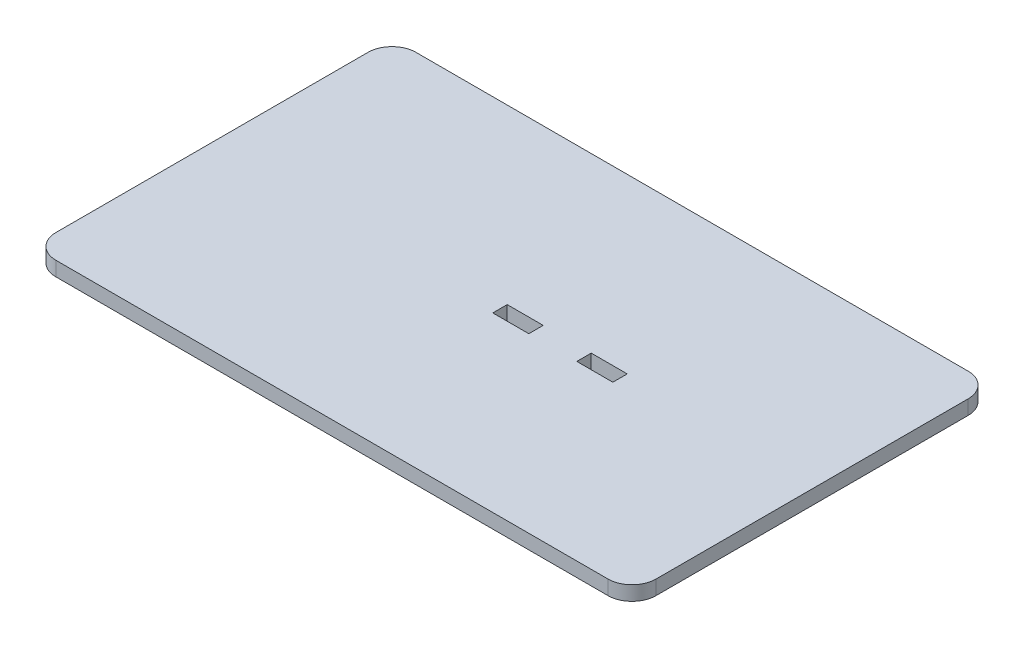
ISO-10303-21;
HEADER;
FILE_DESCRIPTION(('STEP AP214'),'2;1');
FILE_NAME('part.step','',(''),(''),'','','');
FILE_SCHEMA(('AUTOMOTIVE_DESIGN { 1 0 10303 214 1 1 1 1 }'));
ENDSEC;
DATA;
#1=APPLICATION_CONTEXT('core data for automotive mechanical design processes');
#2=APPLICATION_PROTOCOL_DEFINITION('international standard','automotive_design',2000,#1);
#3=PRODUCT_CONTEXT('',#1,'mechanical');
#4=PRODUCT('Part','Part','',(#3));
#5=PRODUCT_RELATED_PRODUCT_CATEGORY('part','',(#4));
#6=PRODUCT_DEFINITION_FORMATION('','',#4);
#7=PRODUCT_DEFINITION_CONTEXT('part definition',#1,'design');
#8=PRODUCT_DEFINITION('design','',#6,#7);
#9=PRODUCT_DEFINITION_SHAPE('','',#8);
#10=(LENGTH_UNIT() NAMED_UNIT(*) SI_UNIT(.MILLI.,.METRE.));
#11=(NAMED_UNIT(*) PLANE_ANGLE_UNIT() SI_UNIT($,.RADIAN.));
#12=(NAMED_UNIT(*) SI_UNIT($,.STERADIAN.) SOLID_ANGLE_UNIT());
#13=UNCERTAINTY_MEASURE_WITH_UNIT(LENGTH_MEASURE(1.E-05),#10,'distance_accuracy_value','');
#14=(GEOMETRIC_REPRESENTATION_CONTEXT(3) GLOBAL_UNCERTAINTY_ASSIGNED_CONTEXT((#13)) GLOBAL_UNIT_ASSIGNED_CONTEXT((#10,
#11,#12)) REPRESENTATION_CONTEXT('',''));
#15=CARTESIAN_POINT('',(0.,0.,0.));
#16=DIRECTION('',(0.,0.,1.));
#17=DIRECTION('',(1.,0.,0.));
#18=AXIS2_PLACEMENT_3D('',#15,#16,#17);
#19=CARTESIAN_POINT('',(0.,6.,0.));
#20=DIRECTION('',(0.,1.,0.));
#21=DIRECTION('',(0.,0.,1.));
#22=AXIS2_PLACEMENT_3D('',#19,#20,#21);
#23=PLANE('',#22);
#24=DIRECTION('',(1.,0.,0.));
#25=VECTOR('',#24,1.);
#26=CARTESIAN_POINT('',(0.,6.,16.9792899408284));
#27=LINE('',#26,#25);
#28=CARTESIAN_POINT('',(21.0355029585799,6.,16.9792899408284));
#29=VERTEX_POINT('',#28);
#30=CARTESIAN_POINT('',(36.0355029585799,6.,16.9792899408284));
#31=VERTEX_POINT('',#30);
#32=EDGE_CURVE('E186',#29,#31,#27,.T.);
#33=ORIENTED_EDGE('',*,*,#32,.F.);
#34=DIRECTION('',(0.,0.,-1.));
#35=VECTOR('',#34,1.);
#36=CARTESIAN_POINT('',(21.0355029585799,6.,16.9792899408284));
#37=LINE('',#36,#35);
#38=CARTESIAN_POINT('',(21.0355029585799,6.,10.9792899408284));
#39=VERTEX_POINT('',#38);
#40=EDGE_CURVE('E166',#29,#39,#37,.T.);
#41=ORIENTED_EDGE('',*,*,#40,.T.);
#42=DIRECTION('',(1.,0.,0.));
#43=VECTOR('',#42,1.);
#44=CARTESIAN_POINT('',(0.,6.,10.9792899408284));
#45=LINE('',#44,#43);
#46=CARTESIAN_POINT('',(36.0355029585799,6.,10.9792899408284));
#47=VERTEX_POINT('',#46);
#48=EDGE_CURVE('E177',#39,#47,#45,.T.);
#49=ORIENTED_EDGE('',*,*,#48,.T.);
#50=DIRECTION('',(0.,0.,-1.));
#51=VECTOR('',#50,1.);
#52=CARTESIAN_POINT('',(36.0355029585799,6.,16.9792899408284));
#53=LINE('',#52,#51);
#54=EDGE_CURVE('E179',#31,#47,#53,.T.);
#55=ORIENTED_EDGE('',*,*,#54,.F.);
#56=EDGE_LOOP('',(#33,#41,#49,#55));
#57=FACE_BOUND('',#56,.T.);
#58=CARTESIAN_POINT('',(56.0355029585799,6.,16.9792899408284));
#59=VERTEX_POINT('',#58);
#60=CARTESIAN_POINT('',(71.0355029585799,6.,16.9792899408284));
#61=VERTEX_POINT('',#60);
#62=EDGE_CURVE('E183',#59,#61,#27,.T.);
#63=ORIENTED_EDGE('',*,*,#62,.F.);
#64=DIRECTION('',(0.,0.,-1.));
#65=VECTOR('',#64,1.);
#66=CARTESIAN_POINT('',(56.0355029585799,6.,16.9792899408284));
#67=LINE('',#66,#65);
#68=CARTESIAN_POINT('',(56.0355029585799,6.,10.9792899408284));
#69=VERTEX_POINT('',#68);
#70=EDGE_CURVE('E344',#59,#69,#67,.T.);
#71=ORIENTED_EDGE('',*,*,#70,.T.);
#72=CARTESIAN_POINT('',(71.0355029585799,6.,10.9792899408284));
#73=VERTEX_POINT('',#72);
#74=EDGE_CURVE('E173',#69,#73,#45,.T.);
#75=ORIENTED_EDGE('',*,*,#74,.T.);
#76=DIRECTION('',(0.,0.,-1.));
#77=VECTOR('',#76,1.);
#78=CARTESIAN_POINT('',(71.0355029585799,6.,16.9792899408284));
#79=LINE('',#78,#77);
#80=EDGE_CURVE('E333',#61,#73,#79,.T.);
#81=ORIENTED_EDGE('',*,*,#80,.F.);
#82=EDGE_LOOP('',(#63,#71,#75,#81));
#83=FACE_BOUND('',#82,.T.);
#84=DIRECTION('',(-1.,0.,0.));
#85=VECTOR('',#84,1.);
#86=CARTESIAN_POINT('',(-98.9644970414201,6.,-61.0207100591716));
#87=LINE('',#86,#85);
#88=CARTESIAN_POINT('',(141.03550295858,6.,-61.0207100591716));
#89=VERTEX_POINT('',#88);
#90=CARTESIAN_POINT('',(-88.9644970414201,6.,-61.0207100591716));
#91=VERTEX_POINT('',#90);
#92=EDGE_CURVE('E195',#89,#91,#87,.T.);
#93=ORIENTED_EDGE('',*,*,#92,.T.);
#94=CARTESIAN_POINT('',(-88.9644970414201,6.,-51.0207100591716));
#95=DIRECTION('',(0.,1.,0.));
#96=DIRECTION('',(0.,0.,1.));
#97=AXIS2_PLACEMENT_3D('',#94,#95,#96);
#98=CIRCLE('',#97,10.);
#99=CARTESIAN_POINT('',(-98.9644970414201,6.,-51.0207100591716));
#100=VERTEX_POINT('',#99);
#101=EDGE_CURVE('E231',#91,#100,#98,.T.);
#102=ORIENTED_EDGE('',*,*,#101,.T.);
#103=DIRECTION('',(0.,0.,1.));
#104=VECTOR('',#103,1.);
#105=CARTESIAN_POINT('',(-98.9644970414201,6.,-61.0207100591716));
#106=LINE('',#105,#104);
#107=CARTESIAN_POINT('',(-98.9644970414201,6.,78.9792899408284));
#108=VERTEX_POINT('',#107);
#109=EDGE_CURVE('E187',#100,#108,#106,.T.);
#110=ORIENTED_EDGE('',*,*,#109,.T.);
#111=CARTESIAN_POINT('',(-88.9644970414201,6.,78.9792899408284));
#112=DIRECTION('',(0.,1.,0.));
#113=DIRECTION('',(0.,0.,1.));
#114=AXIS2_PLACEMENT_3D('',#111,#112,#113);
#115=CIRCLE('',#114,10.);
#116=CARTESIAN_POINT('',(-88.9644970414201,6.,88.9792899408284));
#117=VERTEX_POINT('',#116);
#118=EDGE_CURVE('E227',#108,#117,#115,.T.);
#119=ORIENTED_EDGE('',*,*,#118,.T.);
#120=DIRECTION('',(1.,0.,0.));
#121=VECTOR('',#120,1.);
#122=CARTESIAN_POINT('',(-98.9644970414201,6.,88.9792899408284));
#123=LINE('',#122,#121);
#124=CARTESIAN_POINT('',(141.03550295858,6.,88.9792899408284));
#125=VERTEX_POINT('',#124);
#126=EDGE_CURVE('E190',#117,#125,#123,.T.);
#127=ORIENTED_EDGE('',*,*,#126,.T.);
#128=CARTESIAN_POINT('',(141.03550295858,6.,78.9792899408284));
#129=DIRECTION('',(0.,1.,0.));
#130=DIRECTION('',(0.,0.,1.));
#131=AXIS2_PLACEMENT_3D('',#128,#129,#130);
#132=CIRCLE('',#131,10.);
#133=CARTESIAN_POINT('',(151.03550295858,6.,78.9792899408284));
#134=VERTEX_POINT('',#133);
#135=EDGE_CURVE('E55',#125,#134,#132,.T.);
#136=ORIENTED_EDGE('',*,*,#135,.T.);
#137=DIRECTION('',(0.,0.,-1.));
#138=VECTOR('',#137,1.);
#139=CARTESIAN_POINT('',(151.03550295858,6.,-61.0207100591716));
#140=LINE('',#139,#138);
#141=CARTESIAN_POINT('',(151.03550295858,6.,-51.0207100591716));
#142=VERTEX_POINT('',#141);
#143=EDGE_CURVE('E193',#134,#142,#140,.T.);
#144=ORIENTED_EDGE('',*,*,#143,.T.);
#145=CARTESIAN_POINT('',(141.03550295858,6.,-51.0207100591716));
#146=DIRECTION('',(0.,1.,0.));
#147=DIRECTION('',(0.,0.,1.));
#148=AXIS2_PLACEMENT_3D('',#145,#146,#147);
#149=CIRCLE('',#148,10.);
#150=EDGE_CURVE('E229',#142,#89,#149,.T.);
#151=ORIENTED_EDGE('',*,*,#150,.T.);
#152=EDGE_LOOP('',(#93,#102,#110,#119,#127,#136,#144,#151));
#153=FACE_BOUND('',#152,.T.);
#154=ADVANCED_FACE('F33',(#57,#83,#153),#23,.T.);
#155=CARTESIAN_POINT('',(0.,0.,0.));
#156=DIRECTION('',(0.,1.,0.));
#157=DIRECTION('',(0.,0.,1.));
#158=AXIS2_PLACEMENT_3D('',#155,#156,#157);
#159=PLANE('',#158);
#160=DIRECTION('',(0.,0.,-1.));
#161=VECTOR('',#160,1.);
#162=CARTESIAN_POINT('',(56.0355029585799,0.,16.9792899408284));
#163=LINE('',#162,#161);
#164=CARTESIAN_POINT('',(56.0355029585799,0.,16.9792899408284));
#165=VERTEX_POINT('',#164);
#166=CARTESIAN_POINT('',(56.0355029585799,0.,10.9792899408284));
#167=VERTEX_POINT('',#166);
#168=EDGE_CURVE('E337',#165,#167,#163,.T.);
#169=ORIENTED_EDGE('',*,*,#168,.F.);
#170=DIRECTION('',(1.,0.,0.));
#171=VECTOR('',#170,1.);
#172=CARTESIAN_POINT('',(56.0355029585799,0.,16.9792899408284));
#173=LINE('',#172,#171);
#174=CARTESIAN_POINT('',(71.0355029585799,0.,16.9792899408284));
#175=VERTEX_POINT('',#174);
#176=EDGE_CURVE('E364',#165,#175,#173,.T.);
#177=ORIENTED_EDGE('',*,*,#176,.T.);
#178=DIRECTION('',(0.,0.,-1.));
#179=VECTOR('',#178,1.);
#180=CARTESIAN_POINT('',(71.0355029585799,0.,16.9792899408284));
#181=LINE('',#180,#179);
#182=CARTESIAN_POINT('',(71.0355029585799,0.,10.9792899408284));
#183=VERTEX_POINT('',#182);
#184=EDGE_CURVE('E334',#175,#183,#181,.T.);
#185=ORIENTED_EDGE('',*,*,#184,.T.);
#186=DIRECTION('',(1.,0.,0.));
#187=VECTOR('',#186,1.);
#188=CARTESIAN_POINT('',(56.0355029585799,0.,10.9792899408284));
#189=LINE('',#188,#187);
#190=EDGE_CURVE('E359',#167,#183,#189,.T.);
#191=ORIENTED_EDGE('',*,*,#190,.F.);
#192=EDGE_LOOP('',(#169,#177,#185,#191));
#193=FACE_BOUND('',#192,.T.);
#194=DIRECTION('',(0.,0.,1.));
#195=VECTOR('',#194,1.);
#196=CARTESIAN_POINT('',(-98.9644970414201,0.,-61.0207100591716));
#197=LINE('',#196,#195);
#198=CARTESIAN_POINT('',(-98.9644970414201,0.,-51.0207100591716));
#199=VERTEX_POINT('',#198);
#200=CARTESIAN_POINT('',(-98.9644970414201,0.,78.9792899408284));
#201=VERTEX_POINT('',#200);
#202=EDGE_CURVE('E199',#199,#201,#197,.T.);
#203=ORIENTED_EDGE('',*,*,#202,.F.);
#204=CARTESIAN_POINT('',(-88.9644970414201,0.,-51.0207100591716));
#205=DIRECTION('',(0.,1.,0.));
#206=DIRECTION('',(0.,0.,1.));
#207=AXIS2_PLACEMENT_3D('',#204,#205,#206);
#208=CIRCLE('',#207,10.);
#209=CARTESIAN_POINT('',(-88.9644970414201,0.,-61.0207100591716));
#210=VERTEX_POINT('',#209);
#211=EDGE_CURVE('E219',#199,#210,#208,.F.);
#212=ORIENTED_EDGE('',*,*,#211,.T.);
#213=DIRECTION('',(-1.,0.,0.));
#214=VECTOR('',#213,1.);
#215=CARTESIAN_POINT('',(-98.9644970414201,0.,-61.0207100591716));
#216=LINE('',#215,#214);
#217=CARTESIAN_POINT('',(141.03550295858,0.,-61.0207100591716));
#218=VERTEX_POINT('',#217);
#219=EDGE_CURVE('E191',#218,#210,#216,.T.);
#220=ORIENTED_EDGE('',*,*,#219,.F.);
#221=CARTESIAN_POINT('',(141.03550295858,0.,-51.0207100591716));
#222=DIRECTION('',(0.,1.,0.));
#223=DIRECTION('',(0.,0.,1.));
#224=AXIS2_PLACEMENT_3D('',#221,#222,#223);
#225=CIRCLE('',#224,10.);
#226=CARTESIAN_POINT('',(151.03550295858,0.,-51.0207100591716));
#227=VERTEX_POINT('',#226);
#228=EDGE_CURVE('E217',#218,#227,#225,.F.);
#229=ORIENTED_EDGE('',*,*,#228,.T.);
#230=DIRECTION('',(0.,0.,-1.));
#231=VECTOR('',#230,1.);
#232=CARTESIAN_POINT('',(151.03550295858,0.,-61.0207100591716));
#233=LINE('',#232,#231);
#234=CARTESIAN_POINT('',(151.03550295858,0.,78.9792899408284));
#235=VERTEX_POINT('',#234);
#236=EDGE_CURVE('E205',#235,#227,#233,.T.);
#237=ORIENTED_EDGE('',*,*,#236,.F.);
#238=CARTESIAN_POINT('',(141.03550295858,0.,78.9792899408284));
#239=DIRECTION('',(0.,1.,0.));
#240=DIRECTION('',(0.,0.,1.));
#241=AXIS2_PLACEMENT_3D('',#238,#239,#240);
#242=CIRCLE('',#241,10.);
#243=CARTESIAN_POINT('',(141.03550295858,0.,88.9792899408284));
#244=VERTEX_POINT('',#243);
#245=EDGE_CURVE('E213',#235,#244,#242,.F.);
#246=ORIENTED_EDGE('',*,*,#245,.T.);
#247=DIRECTION('',(1.,0.,0.));
#248=VECTOR('',#247,1.);
#249=CARTESIAN_POINT('',(-98.9644970414201,0.,88.9792899408284));
#250=LINE('',#249,#248);
#251=CARTESIAN_POINT('',(-88.9644970414201,0.,88.9792899408284));
#252=VERTEX_POINT('',#251);
#253=EDGE_CURVE('E202',#252,#244,#250,.T.);
#254=ORIENTED_EDGE('',*,*,#253,.F.);
#255=CARTESIAN_POINT('',(-88.9644970414201,0.,78.9792899408284));
#256=DIRECTION('',(0.,1.,0.));
#257=DIRECTION('',(0.,0.,1.));
#258=AXIS2_PLACEMENT_3D('',#255,#256,#257);
#259=CIRCLE('',#258,10.);
#260=EDGE_CURVE('E215',#252,#201,#259,.F.);
#261=ORIENTED_EDGE('',*,*,#260,.T.);
#262=EDGE_LOOP('',(#203,#212,#220,#229,#237,#246,#254,#261));
#263=FACE_BOUND('',#262,.T.);
#264=DIRECTION('',(0.,0.,-1.));
#265=VECTOR('',#264,1.);
#266=CARTESIAN_POINT('',(21.0355029585799,0.,16.9792899408284));
#267=LINE('',#266,#265);
#268=CARTESIAN_POINT('',(21.0355029585799,0.,16.9792899408284));
#269=VERTEX_POINT('',#268);
#270=CARTESIAN_POINT('',(21.0355029585799,0.,10.9792899408284));
#271=VERTEX_POINT('',#270);
#272=EDGE_CURVE('E163',#269,#271,#267,.T.);
#273=ORIENTED_EDGE('',*,*,#272,.F.);
#274=DIRECTION('',(1.,0.,0.));
#275=VECTOR('',#274,1.);
#276=CARTESIAN_POINT('',(21.0355029585799,0.,16.9792899408284));
#277=LINE('',#276,#275);
#278=CARTESIAN_POINT('',(36.0355029585799,0.,16.9792899408284));
#279=VERTEX_POINT('',#278);
#280=EDGE_CURVE('E149',#269,#279,#277,.T.);
#281=ORIENTED_EDGE('',*,*,#280,.T.);
#282=DIRECTION('',(0.,0.,-1.));
#283=VECTOR('',#282,1.);
#284=CARTESIAN_POINT('',(36.0355029585799,0.,16.9792899408284));
#285=LINE('',#284,#283);
#286=CARTESIAN_POINT('',(36.0355029585799,0.,10.9792899408284));
#287=VERTEX_POINT('',#286);
#288=EDGE_CURVE('E174',#279,#287,#285,.T.);
#289=ORIENTED_EDGE('',*,*,#288,.T.);
#290=DIRECTION('',(1.,0.,0.));
#291=VECTOR('',#290,1.);
#292=CARTESIAN_POINT('',(21.0355029585799,0.,10.9792899408284));
#293=LINE('',#292,#291);
#294=EDGE_CURVE('E172',#271,#287,#293,.T.);
#295=ORIENTED_EDGE('',*,*,#294,.F.);
#296=EDGE_LOOP('',(#273,#281,#289,#295));
#297=FACE_BOUND('',#296,.T.);
#298=ADVANCED_FACE('F170',(#193,#263,#297),#159,.F.);
#299=CARTESIAN_POINT('',(-98.9644970414201,6.,-61.0207100591716));
#300=DIRECTION('',(1.,0.,0.));
#301=DIRECTION('',(0.,0.,-1.));
#302=AXIS2_PLACEMENT_3D('',#299,#300,#301);
#303=PLANE('',#302);
#304=ORIENTED_EDGE('',*,*,#109,.F.);
#305=DIRECTION('',(0.,-1.,0.));
#306=VECTOR('',#305,1.);
#307=CARTESIAN_POINT('',(-98.9644970414201,6.,-51.0207100591716));
#308=LINE('',#307,#306);
#309=EDGE_CURVE('E210',#100,#199,#308,.T.);
#310=ORIENTED_EDGE('',*,*,#309,.T.);
#311=ORIENTED_EDGE('',*,*,#202,.T.);
#312=DIRECTION('',(0.,-1.,0.));
#313=VECTOR('',#312,1.);
#314=CARTESIAN_POINT('',(-98.9644970414201,6.,78.9792899408284));
#315=LINE('',#314,#313);
#316=EDGE_CURVE('E198',#201,#108,#315,.F.);
#317=ORIENTED_EDGE('',*,*,#316,.T.);
#318=EDGE_LOOP('',(#304,#310,#311,#317));
#319=FACE_BOUND('',#318,.T.);
#320=ADVANCED_FACE('F264',(#319),#303,.F.);
#321=CARTESIAN_POINT('',(-98.9644970414201,6.,88.9792899408284));
#322=DIRECTION('',(0.,0.,-1.));
#323=DIRECTION('',(-1.,0.,0.));
#324=AXIS2_PLACEMENT_3D('',#321,#322,#323);
#325=PLANE('',#324);
#326=ORIENTED_EDGE('',*,*,#126,.F.);
#327=DIRECTION('',(0.,-1.,0.));
#328=VECTOR('',#327,1.);
#329=CARTESIAN_POINT('',(-88.9644970414201,6.,88.9792899408284));
#330=LINE('',#329,#328);
#331=EDGE_CURVE('E11',#117,#252,#330,.T.);
#332=ORIENTED_EDGE('',*,*,#331,.T.);
#333=ORIENTED_EDGE('',*,*,#253,.T.);
#334=DIRECTION('',(0.,-1.,0.));
#335=VECTOR('',#334,1.);
#336=CARTESIAN_POINT('',(141.03550295858,6.,88.9792899408284));
#337=LINE('',#336,#335);
#338=EDGE_CURVE('E41',#244,#125,#337,.F.);
#339=ORIENTED_EDGE('',*,*,#338,.T.);
#340=EDGE_LOOP('',(#326,#332,#333,#339));
#341=FACE_BOUND('',#340,.T.);
#342=ADVANCED_FACE('F239',(#341),#325,.F.);
#343=CARTESIAN_POINT('',(151.03550295858,6.,-61.0207100591716));
#344=DIRECTION('',(-1.,0.,0.));
#345=DIRECTION('',(0.,0.,1.));
#346=AXIS2_PLACEMENT_3D('',#343,#344,#345);
#347=PLANE('',#346);
#348=ORIENTED_EDGE('',*,*,#236,.T.);
#349=DIRECTION('',(0.,-1.,0.));
#350=VECTOR('',#349,1.);
#351=CARTESIAN_POINT('',(151.03550295858,6.,-51.0207100591716));
#352=LINE('',#351,#350);
#353=EDGE_CURVE('E48',#227,#142,#352,.F.);
#354=ORIENTED_EDGE('',*,*,#353,.T.);
#355=ORIENTED_EDGE('',*,*,#143,.F.);
#356=DIRECTION('',(0.,-1.,0.));
#357=VECTOR('',#356,1.);
#358=CARTESIAN_POINT('',(151.03550295858,6.,78.9792899408284));
#359=LINE('',#358,#357);
#360=EDGE_CURVE('E233',#134,#235,#359,.T.);
#361=ORIENTED_EDGE('',*,*,#360,.T.);
#362=EDGE_LOOP('',(#348,#354,#355,#361));
#363=FACE_BOUND('',#362,.T.);
#364=ADVANCED_FACE('F246',(#363),#347,.F.);
#365=CARTESIAN_POINT('',(-98.9644970414201,6.,-61.0207100591716));
#366=DIRECTION('',(0.,0.,1.));
#367=DIRECTION('',(1.,0.,0.));
#368=AXIS2_PLACEMENT_3D('',#365,#366,#367);
#369=PLANE('',#368);
#370=ORIENTED_EDGE('',*,*,#219,.T.);
#371=DIRECTION('',(0.,-1.,0.));
#372=VECTOR('',#371,1.);
#373=CARTESIAN_POINT('',(-88.9644970414201,6.,-61.0207100591716));
#374=LINE('',#373,#372);
#375=EDGE_CURVE('E224',#210,#91,#374,.F.);
#376=ORIENTED_EDGE('',*,*,#375,.T.);
#377=ORIENTED_EDGE('',*,*,#92,.F.);
#378=DIRECTION('',(0.,-1.,0.));
#379=VECTOR('',#378,1.);
#380=CARTESIAN_POINT('',(141.03550295858,6.,-61.0207100591716));
#381=LINE('',#380,#379);
#382=EDGE_CURVE('E221',#89,#218,#381,.T.);
#383=ORIENTED_EDGE('',*,*,#382,.T.);
#384=EDGE_LOOP('',(#370,#376,#377,#383));
#385=FACE_BOUND('',#384,.T.);
#386=ADVANCED_FACE('F256',(#385),#369,.F.);
#387=CARTESIAN_POINT('',(71.0355029585799,0.,16.9792899408284));
#388=DIRECTION('',(-1.,0.,0.));
#389=DIRECTION('',(0.,0.,1.));
#390=AXIS2_PLACEMENT_3D('',#387,#388,#389);
#391=PLANE('',#390);
#392=DIRECTION('',(0.,1.,0.));
#393=VECTOR('',#392,1.);
#394=CARTESIAN_POINT('',(71.0355029585799,0.,10.9792899408284));
#395=LINE('',#394,#393);
#396=EDGE_CURVE('E167',#183,#73,#395,.T.);
#397=ORIENTED_EDGE('',*,*,#396,.F.);
#398=ORIENTED_EDGE('',*,*,#184,.F.);
#399=DIRECTION('',(0.,1.,0.));
#400=VECTOR('',#399,1.);
#401=CARTESIAN_POINT('',(71.0355029585799,0.,16.9792899408284));
#402=LINE('',#401,#400);
#403=EDGE_CURVE('E328',#175,#61,#402,.T.);
#404=ORIENTED_EDGE('',*,*,#403,.T.);
#405=ORIENTED_EDGE('',*,*,#80,.T.);
#406=EDGE_LOOP('',(#397,#398,#404,#405));
#407=FACE_BOUND('',#406,.T.);
#408=ADVANCED_FACE('F289',(#407),#391,.T.);
#409=CARTESIAN_POINT('',(56.0355029585799,6.,16.9792899408284));
#410=DIRECTION('',(1.,0.,0.));
#411=DIRECTION('',(0.,0.,-1.));
#412=AXIS2_PLACEMENT_3D('',#409,#410,#411);
#413=PLANE('',#412);
#414=DIRECTION('',(0.,-1.,0.));
#415=VECTOR('',#414,1.);
#416=CARTESIAN_POINT('',(56.0355029585799,6.,10.9792899408284));
#417=LINE('',#416,#415);
#418=EDGE_CURVE('E357',#69,#167,#417,.T.);
#419=ORIENTED_EDGE('',*,*,#418,.F.);
#420=ORIENTED_EDGE('',*,*,#70,.F.);
#421=DIRECTION('',(0.,-1.,0.));
#422=VECTOR('',#421,1.);
#423=CARTESIAN_POINT('',(56.0355029585799,6.,16.9792899408284));
#424=LINE('',#423,#422);
#425=EDGE_CURVE('E330',#59,#165,#424,.T.);
#426=ORIENTED_EDGE('',*,*,#425,.T.);
#427=ORIENTED_EDGE('',*,*,#168,.T.);
#428=EDGE_LOOP('',(#419,#420,#426,#427));
#429=FACE_BOUND('',#428,.T.);
#430=ADVANCED_FACE('F306',(#429),#413,.T.);
#431=CARTESIAN_POINT('',(71.0355029585799,9.45471756061298,10.9792899408284));
#432=DIRECTION('',(0.,0.,1.));
#433=DIRECTION('',(1.,0.,0.));
#434=AXIS2_PLACEMENT_3D('',#431,#432,#433);
#435=PLANE('',#434);
#436=ORIENTED_EDGE('',*,*,#418,.T.);
#437=ORIENTED_EDGE('',*,*,#190,.T.);
#438=ORIENTED_EDGE('',*,*,#396,.T.);
#439=ORIENTED_EDGE('',*,*,#74,.F.);
#440=EDGE_LOOP('',(#436,#437,#438,#439));
#441=FACE_BOUND('',#440,.T.);
#442=ADVANCED_FACE('F309',(#441),#435,.T.);
#443=CARTESIAN_POINT('',(71.0355029585799,9.45471756061298,16.9792899408284));
#444=DIRECTION('',(0.,0.,1.));
#445=DIRECTION('',(1.,0.,0.));
#446=AXIS2_PLACEMENT_3D('',#443,#444,#445);
#447=PLANE('',#446);
#448=ORIENTED_EDGE('',*,*,#62,.T.);
#449=ORIENTED_EDGE('',*,*,#403,.F.);
#450=ORIENTED_EDGE('',*,*,#176,.F.);
#451=ORIENTED_EDGE('',*,*,#425,.F.);
#452=EDGE_LOOP('',(#448,#449,#450,#451));
#453=FACE_BOUND('',#452,.T.);
#454=ADVANCED_FACE('F316',(#453),#447,.F.);
#455=ORIENTED_EDGE('',*,*,#32,.T.);
#456=DIRECTION('',(0.,1.,0.));
#457=VECTOR('',#456,1.);
#458=CARTESIAN_POINT('',(36.0355029585799,0.,16.9792899408284));
#459=LINE('',#458,#457);
#460=EDGE_CURVE('E155',#279,#31,#459,.T.);
#461=ORIENTED_EDGE('',*,*,#460,.F.);
#462=ORIENTED_EDGE('',*,*,#280,.F.);
#463=DIRECTION('',(0.,-1.,0.));
#464=VECTOR('',#463,1.);
#465=CARTESIAN_POINT('',(21.0355029585799,6.,16.9792899408284));
#466=LINE('',#465,#464);
#467=EDGE_CURVE('E153',#29,#269,#466,.T.);
#468=ORIENTED_EDGE('',*,*,#467,.F.);
#469=EDGE_LOOP('',(#455,#461,#462,#468));
#470=FACE_BOUND('',#469,.T.);
#471=ADVANCED_FACE('F152',(#470),#447,.F.);
#472=DIRECTION('',(0.,-1.,0.));
#473=VECTOR('',#472,1.);
#474=CARTESIAN_POINT('',(21.0355029585799,6.,10.9792899408284));
#475=LINE('',#474,#473);
#476=EDGE_CURVE('E350',#39,#271,#475,.T.);
#477=ORIENTED_EDGE('',*,*,#476,.T.);
#478=ORIENTED_EDGE('',*,*,#294,.T.);
#479=DIRECTION('',(0.,1.,0.));
#480=VECTOR('',#479,1.);
#481=CARTESIAN_POINT('',(36.0355029585799,0.,10.9792899408284));
#482=LINE('',#481,#480);
#483=EDGE_CURVE('E348',#287,#47,#482,.T.);
#484=ORIENTED_EDGE('',*,*,#483,.T.);
#485=ORIENTED_EDGE('',*,*,#48,.F.);
#486=EDGE_LOOP('',(#477,#478,#484,#485));
#487=FACE_BOUND('',#486,.T.);
#488=ADVANCED_FACE('F304',(#487),#435,.T.);
#489=CARTESIAN_POINT('',(21.0355029585799,6.,16.9792899408284));
#490=DIRECTION('',(1.,0.,0.));
#491=DIRECTION('',(0.,1.,0.));
#492=AXIS2_PLACEMENT_3D('',#489,#490,#491);
#493=PLANE('',#492);
#494=ORIENTED_EDGE('',*,*,#476,.F.);
#495=ORIENTED_EDGE('',*,*,#40,.F.);
#496=ORIENTED_EDGE('',*,*,#467,.T.);
#497=ORIENTED_EDGE('',*,*,#272,.T.);
#498=EDGE_LOOP('',(#494,#495,#496,#497));
#499=FACE_BOUND('',#498,.T.);
#500=ADVANCED_FACE('F162',(#499),#493,.T.);
#501=CARTESIAN_POINT('',(36.0355029585799,0.,16.9792899408284));
#502=DIRECTION('',(-1.,0.,0.));
#503=DIRECTION('',(0.,0.,1.));
#504=AXIS2_PLACEMENT_3D('',#501,#502,#503);
#505=PLANE('',#504);
#506=ORIENTED_EDGE('',*,*,#483,.F.);
#507=ORIENTED_EDGE('',*,*,#288,.F.);
#508=ORIENTED_EDGE('',*,*,#460,.T.);
#509=ORIENTED_EDGE('',*,*,#54,.T.);
#510=EDGE_LOOP('',(#506,#507,#508,#509));
#511=FACE_BOUND('',#510,.T.);
#512=ADVANCED_FACE('F297',(#511),#505,.T.);
#513=CARTESIAN_POINT('',(-88.9644970414201,6.,-51.0207100591716));
#514=DIRECTION('',(0.,-1.,0.));
#515=DIRECTION('',(0.,0.,-1.));
#516=AXIS2_PLACEMENT_3D('',#513,#514,#515);
#517=CYLINDRICAL_SURFACE('',#516,10.);
#518=ORIENTED_EDGE('',*,*,#101,.F.);
#519=ORIENTED_EDGE('',*,*,#375,.F.);
#520=ORIENTED_EDGE('',*,*,#211,.F.);
#521=ORIENTED_EDGE('',*,*,#309,.F.);
#522=EDGE_LOOP('',(#518,#519,#520,#521));
#523=FACE_BOUND('',#522,.T.);
#524=ADVANCED_FACE('F262',(#523),#517,.T.);
#525=CARTESIAN_POINT('',(141.03550295858,6.,-51.0207100591716));
#526=DIRECTION('',(0.,-1.,0.));
#527=DIRECTION('',(0.,0.,-1.));
#528=AXIS2_PLACEMENT_3D('',#525,#526,#527);
#529=CYLINDRICAL_SURFACE('',#528,10.);
#530=ORIENTED_EDGE('',*,*,#150,.F.);
#531=ORIENTED_EDGE('',*,*,#353,.F.);
#532=ORIENTED_EDGE('',*,*,#228,.F.);
#533=ORIENTED_EDGE('',*,*,#382,.F.);
#534=EDGE_LOOP('',(#530,#531,#532,#533));
#535=FACE_BOUND('',#534,.T.);
#536=ADVANCED_FACE('F253',(#535),#529,.T.);
#537=CARTESIAN_POINT('',(-88.9644970414201,6.,78.9792899408284));
#538=DIRECTION('',(0.,-1.,0.));
#539=DIRECTION('',(0.,0.,-1.));
#540=AXIS2_PLACEMENT_3D('',#537,#538,#539);
#541=CYLINDRICAL_SURFACE('',#540,10.);
#542=ORIENTED_EDGE('',*,*,#118,.F.);
#543=ORIENTED_EDGE('',*,*,#316,.F.);
#544=ORIENTED_EDGE('',*,*,#260,.F.);
#545=ORIENTED_EDGE('',*,*,#331,.F.);
#546=EDGE_LOOP('',(#542,#543,#544,#545));
#547=FACE_BOUND('',#546,.T.);
#548=ADVANCED_FACE('F267',(#547),#541,.T.);
#549=CARTESIAN_POINT('',(141.03550295858,6.,78.9792899408284));
#550=DIRECTION('',(0.,-1.,0.));
#551=DIRECTION('',(0.,0.,-1.));
#552=AXIS2_PLACEMENT_3D('',#549,#550,#551);
#553=CYLINDRICAL_SURFACE('',#552,10.);
#554=ORIENTED_EDGE('',*,*,#135,.F.);
#555=ORIENTED_EDGE('',*,*,#338,.F.);
#556=ORIENTED_EDGE('',*,*,#245,.F.);
#557=ORIENTED_EDGE('',*,*,#360,.F.);
#558=EDGE_LOOP('',(#554,#555,#556,#557));
#559=FACE_BOUND('',#558,.T.);
#560=ADVANCED_FACE('F35',(#559),#553,.T.);
#561=CLOSED_SHELL('',(#154,#298,#320,#342,#364,#386,#408,#430,#442,#454,#471,#488,#500,#512,
#524,#536,#548,#560));
#562=MANIFOLD_SOLID_BREP('B2',#561);
#563=ADVANCED_BREP_SHAPE_REPRESENTATION('',(#18,#562),#14);
#564=SHAPE_DEFINITION_REPRESENTATION(#9,#563);
ENDSEC;
END-ISO-10303-21;
